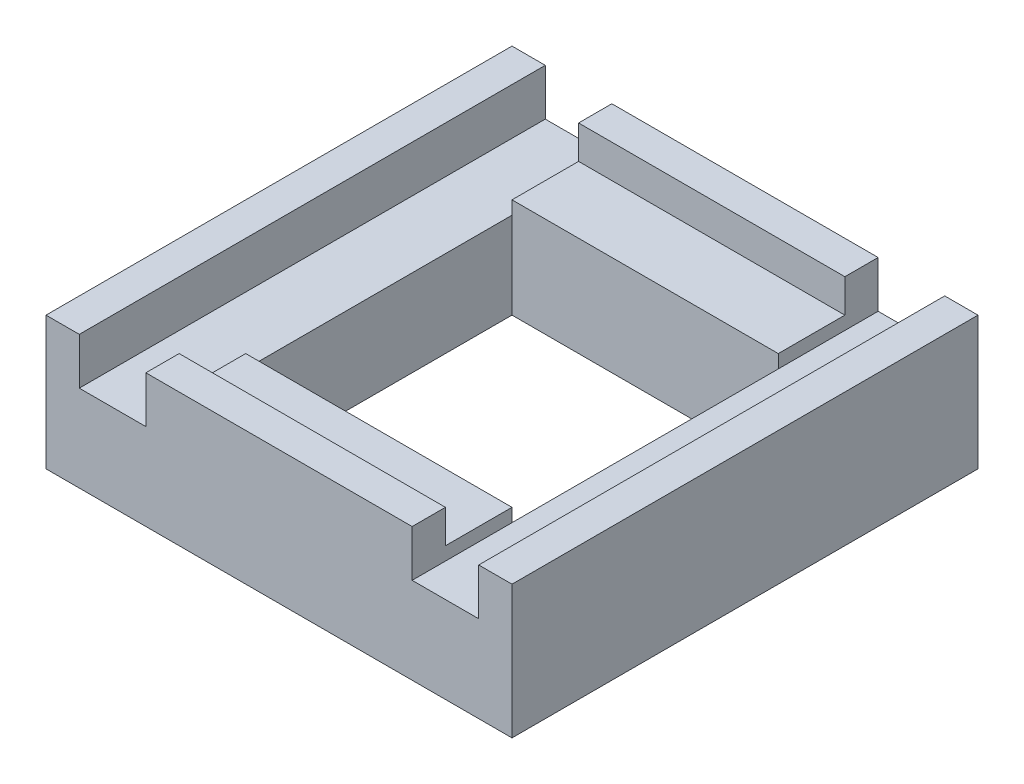
ISO-10303-21;
HEADER;
FILE_DESCRIPTION(('STEP AP214'),'2;1');
FILE_NAME('part.step','',(''),(''),'','','');
FILE_SCHEMA(('AUTOMOTIVE_DESIGN { 1 0 10303 214 1 1 1 1 }'));
ENDSEC;
DATA;
#1=APPLICATION_CONTEXT('core data for automotive mechanical design processes');
#2=APPLICATION_PROTOCOL_DEFINITION('international standard','automotive_design',2000,#1);
#3=PRODUCT_CONTEXT('',#1,'mechanical');
#4=PRODUCT('Part','Part','',(#3));
#5=PRODUCT_RELATED_PRODUCT_CATEGORY('part','',(#4));
#6=PRODUCT_DEFINITION_FORMATION('','',#4);
#7=PRODUCT_DEFINITION_CONTEXT('part definition',#1,'design');
#8=PRODUCT_DEFINITION('design','',#6,#7);
#9=PRODUCT_DEFINITION_SHAPE('','',#8);
#10=(LENGTH_UNIT() NAMED_UNIT(*) SI_UNIT(.MILLI.,.METRE.));
#11=(NAMED_UNIT(*) PLANE_ANGLE_UNIT() SI_UNIT($,.RADIAN.));
#12=(NAMED_UNIT(*) SI_UNIT($,.STERADIAN.) SOLID_ANGLE_UNIT());
#13=UNCERTAINTY_MEASURE_WITH_UNIT(LENGTH_MEASURE(1.E-05),#10,'distance_accuracy_value','');
#14=(GEOMETRIC_REPRESENTATION_CONTEXT(3) GLOBAL_UNCERTAINTY_ASSIGNED_CONTEXT((#13)) GLOBAL_UNIT_ASSIGNED_CONTEXT((#10,
#11,#12)) REPRESENTATION_CONTEXT('',''));
#15=CARTESIAN_POINT('',(0.,0.,0.));
#16=DIRECTION('',(0.,0.,1.));
#17=DIRECTION('',(1.,0.,0.));
#18=AXIS2_PLACEMENT_3D('',#15,#16,#17);
#19=CARTESIAN_POINT('',(0.,15.,0.));
#20=DIRECTION('',(0.,1.,0.));
#21=DIRECTION('',(0.,0.,1.));
#22=AXIS2_PLACEMENT_3D('',#19,#20,#21);
#23=PLANE('',#22);
#24=DIRECTION('',(-1.,0.,0.));
#25=VECTOR('',#24,1.);
#26=CARTESIAN_POINT('',(15.,15.,-55.));
#27=LINE('',#26,#25);
#28=CARTESIAN_POINT('',(55.,15.,-55.));
#29=VERTEX_POINT('',#28);
#30=CARTESIAN_POINT('',(15.,15.,-55.));
#31=VERTEX_POINT('',#30);
#32=EDGE_CURVE('E191',#29,#31,#27,.T.);
#33=ORIENTED_EDGE('',*,*,#32,.F.);
#34=DIRECTION('',(0.,0.,-1.));
#35=VECTOR('',#34,1.);
#36=CARTESIAN_POINT('',(55.,15.,0.));
#37=LINE('',#36,#35);
#38=CARTESIAN_POINT('',(55.,15.,-65.));
#39=VERTEX_POINT('',#38);
#40=EDGE_CURVE('E204',#29,#39,#37,.T.);
#41=ORIENTED_EDGE('',*,*,#40,.T.);
#42=DIRECTION('',(-1.,0.,0.));
#43=VECTOR('',#42,1.);
#44=CARTESIAN_POINT('',(65.,15.,-65.));
#45=LINE('',#44,#43);
#46=CARTESIAN_POINT('',(15.,15.,-65.));
#47=VERTEX_POINT('',#46);
#48=EDGE_CURVE('E245',#39,#47,#45,.T.);
#49=ORIENTED_EDGE('',*,*,#48,.T.);
#50=DIRECTION('',(0.,0.,1.));
#51=VECTOR('',#50,1.);
#52=CARTESIAN_POINT('',(15.,15.,0.));
#53=LINE('',#52,#51);
#54=EDGE_CURVE('E11',#47,#31,#53,.T.);
#55=ORIENTED_EDGE('',*,*,#54,.T.);
#56=EDGE_LOOP('',(#33,#41,#49,#55));
#57=FACE_BOUND('',#56,.T.);
#58=ADVANCED_FACE('F33',(#57),#23,.T.);
#59=CARTESIAN_POINT('',(55.,20.,0.));
#60=DIRECTION('',(1.,0.,0.));
#61=DIRECTION('',(0.,0.,-1.));
#62=AXIS2_PLACEMENT_3D('',#59,#60,#61);
#63=PLANE('',#62);
#64=DIRECTION('',(0.,1.,0.));
#65=VECTOR('',#64,1.);
#66=CARTESIAN_POINT('',(55.,-37.,-55.));
#67=LINE('',#66,#65);
#68=CARTESIAN_POINT('',(55.,13.,-55.));
#69=VERTEX_POINT('',#68);
#70=EDGE_CURVE('E330',#69,#29,#67,.T.);
#71=ORIENTED_EDGE('',*,*,#70,.F.);
#72=DIRECTION('',(0.,0.,1.));
#73=VECTOR('',#72,1.);
#74=CARTESIAN_POINT('',(55.,13.,0.));
#75=LINE('',#74,#73);
#76=CARTESIAN_POINT('',(55.,13.,-70.));
#77=VERTEX_POINT('',#76);
#78=EDGE_CURVE('E284',#77,#69,#75,.T.);
#79=ORIENTED_EDGE('',*,*,#78,.F.);
#80=DIRECTION('',(0.,-1.,0.));
#81=VECTOR('',#80,1.);
#82=CARTESIAN_POINT('',(55.,20.,-70.));
#83=LINE('',#82,#81);
#84=CARTESIAN_POINT('',(55.,20.,-70.));
#85=VERTEX_POINT('',#84);
#86=EDGE_CURVE('E269',#85,#77,#83,.T.);
#87=ORIENTED_EDGE('',*,*,#86,.F.);
#88=DIRECTION('',(0.,0.,1.));
#89=VECTOR('',#88,1.);
#90=CARTESIAN_POINT('',(55.,20.,0.));
#91=LINE('',#90,#89);
#92=CARTESIAN_POINT('',(55.,20.,-65.));
#93=VERTEX_POINT('',#92);
#94=EDGE_CURVE('E278',#85,#93,#91,.T.);
#95=ORIENTED_EDGE('',*,*,#94,.T.);
#96=DIRECTION('',(0.,-1.,0.));
#97=VECTOR('',#96,1.);
#98=CARTESIAN_POINT('',(55.,15.,-65.));
#99=LINE('',#98,#97);
#100=EDGE_CURVE('E260',#93,#39,#99,.T.);
#101=ORIENTED_EDGE('',*,*,#100,.T.);
#102=ORIENTED_EDGE('',*,*,#40,.F.);
#103=EDGE_LOOP('',(#71,#79,#87,#95,#101,#102));
#104=FACE_BOUND('',#103,.T.);
#105=ADVANCED_FACE('F412',(#104),#63,.T.);
#106=CARTESIAN_POINT('',(15.,20.,0.));
#107=DIRECTION('',(-1.,0.,0.));
#108=DIRECTION('',(0.,0.,1.));
#109=AXIS2_PLACEMENT_3D('',#106,#107,#108);
#110=PLANE('',#109);
#111=DIRECTION('',(0.,1.,0.));
#112=VECTOR('',#111,1.);
#113=CARTESIAN_POINT('',(15.,-37.,-55.));
#114=LINE('',#113,#112);
#115=CARTESIAN_POINT('',(15.,13.,-55.));
#116=VERTEX_POINT('',#115);
#117=EDGE_CURVE('E333',#116,#31,#114,.T.);
#118=ORIENTED_EDGE('',*,*,#117,.T.);
#119=ORIENTED_EDGE('',*,*,#54,.F.);
#120=DIRECTION('',(0.,1.,0.));
#121=VECTOR('',#120,1.);
#122=CARTESIAN_POINT('',(15.,15.,-65.));
#123=LINE('',#122,#121);
#124=CARTESIAN_POINT('',(15.,20.,-65.));
#125=VERTEX_POINT('',#124);
#126=EDGE_CURVE('E254',#47,#125,#123,.T.);
#127=ORIENTED_EDGE('',*,*,#126,.T.);
#128=DIRECTION('',(0.,0.,-1.));
#129=VECTOR('',#128,1.);
#130=CARTESIAN_POINT('',(15.,20.,0.));
#131=LINE('',#130,#129);
#132=CARTESIAN_POINT('',(15.,20.,-70.));
#133=VERTEX_POINT('',#132);
#134=EDGE_CURVE('E308',#125,#133,#131,.T.);
#135=ORIENTED_EDGE('',*,*,#134,.T.);
#136=DIRECTION('',(0.,-1.,0.));
#137=VECTOR('',#136,1.);
#138=CARTESIAN_POINT('',(15.,20.,-70.));
#139=LINE('',#138,#137);
#140=CARTESIAN_POINT('',(15.,13.,-70.));
#141=VERTEX_POINT('',#140);
#142=EDGE_CURVE('E300',#133,#141,#139,.T.);
#143=ORIENTED_EDGE('',*,*,#142,.T.);
#144=DIRECTION('',(0.,0.,-1.));
#145=VECTOR('',#144,1.);
#146=CARTESIAN_POINT('',(15.,13.,0.));
#147=LINE('',#146,#145);
#148=EDGE_CURVE('E315',#116,#141,#147,.T.);
#149=ORIENTED_EDGE('',*,*,#148,.F.);
#150=EDGE_LOOP('',(#118,#119,#127,#135,#143,#149));
#151=FACE_BOUND('',#150,.T.);
#152=ADVANCED_FACE('F345',(#151),#110,.T.);
#153=CARTESIAN_POINT('',(0.,20.,0.));
#154=DIRECTION('',(0.,0.,-1.));
#155=DIRECTION('',(-1.,0.,0.));
#156=AXIS2_PLACEMENT_3D('',#153,#154,#155);
#157=PLANE('',#156);
#158=DIRECTION('',(0.,-1.,0.));
#159=VECTOR('',#158,1.);
#160=CARTESIAN_POINT('',(5.,20.,0.));
#161=LINE('',#160,#159);
#162=CARTESIAN_POINT('',(5.,20.,0.));
#163=VERTEX_POINT('',#162);
#164=CARTESIAN_POINT('',(5.,13.,0.));
#165=VERTEX_POINT('',#164);
#166=EDGE_CURVE('E265',#163,#165,#161,.T.);
#167=ORIENTED_EDGE('',*,*,#166,.F.);
#168=DIRECTION('',(1.,0.,0.));
#169=VECTOR('',#168,1.);
#170=CARTESIAN_POINT('',(0.,20.,0.));
#171=LINE('',#170,#169);
#172=CARTESIAN_POINT('',(0.,20.,0.));
#173=VERTEX_POINT('',#172);
#174=EDGE_CURVE('E236',#173,#163,#171,.T.);
#175=ORIENTED_EDGE('',*,*,#174,.F.);
#176=DIRECTION('',(0.,-1.,0.));
#177=VECTOR('',#176,1.);
#178=CARTESIAN_POINT('',(0.,20.,0.));
#179=LINE('',#178,#177);
#180=CARTESIAN_POINT('',(0.,0.,0.));
#181=VERTEX_POINT('',#180);
#182=EDGE_CURVE('E205',#173,#181,#179,.T.);
#183=ORIENTED_EDGE('',*,*,#182,.T.);
#184=DIRECTION('',(1.,0.,0.));
#185=VECTOR('',#184,1.);
#186=CARTESIAN_POINT('',(0.,0.,0.));
#187=LINE('',#186,#185);
#188=CARTESIAN_POINT('',(70.,0.,0.));
#189=VERTEX_POINT('',#188);
#190=EDGE_CURVE('E224',#181,#189,#187,.T.);
#191=ORIENTED_EDGE('',*,*,#190,.T.);
#192=DIRECTION('',(0.,-1.,0.));
#193=VECTOR('',#192,1.);
#194=CARTESIAN_POINT('',(70.,20.,0.));
#195=LINE('',#194,#193);
#196=CARTESIAN_POINT('',(70.,20.,0.));
#197=VERTEX_POINT('',#196);
#198=EDGE_CURVE('E209',#197,#189,#195,.T.);
#199=ORIENTED_EDGE('',*,*,#198,.F.);
#200=CARTESIAN_POINT('',(65.,20.,0.));
#201=VERTEX_POINT('',#200);
#202=EDGE_CURVE('E240',#201,#197,#171,.T.);
#203=ORIENTED_EDGE('',*,*,#202,.F.);
#204=DIRECTION('',(0.,-1.,0.));
#205=VECTOR('',#204,1.);
#206=CARTESIAN_POINT('',(65.,20.,0.));
#207=LINE('',#206,#205);
#208=CARTESIAN_POINT('',(65.,13.,0.));
#209=VERTEX_POINT('',#208);
#210=EDGE_CURVE('E275',#201,#209,#207,.T.);
#211=ORIENTED_EDGE('',*,*,#210,.T.);
#212=DIRECTION('',(1.,0.,0.));
#213=VECTOR('',#212,1.);
#214=CARTESIAN_POINT('',(65.,13.,0.));
#215=LINE('',#214,#213);
#216=CARTESIAN_POINT('',(55.,13.,0.));
#217=VERTEX_POINT('',#216);
#218=EDGE_CURVE('E281',#217,#209,#215,.T.);
#219=ORIENTED_EDGE('',*,*,#218,.F.);
#220=DIRECTION('',(0.,-1.,0.));
#221=VECTOR('',#220,1.);
#222=CARTESIAN_POINT('',(55.,20.,0.));
#223=LINE('',#222,#221);
#224=CARTESIAN_POINT('',(55.,20.,0.));
#225=VERTEX_POINT('',#224);
#226=EDGE_CURVE('E272',#225,#217,#223,.T.);
#227=ORIENTED_EDGE('',*,*,#226,.F.);
#228=CARTESIAN_POINT('',(15.,20.,0.));
#229=VERTEX_POINT('',#228);
#230=EDGE_CURVE('E239',#229,#225,#171,.T.);
#231=ORIENTED_EDGE('',*,*,#230,.F.);
#232=DIRECTION('',(0.,-1.,0.));
#233=VECTOR('',#232,1.);
#234=CARTESIAN_POINT('',(15.,20.,0.));
#235=LINE('',#234,#233);
#236=CARTESIAN_POINT('',(15.,13.,0.));
#237=VERTEX_POINT('',#236);
#238=EDGE_CURVE('E297',#229,#237,#235,.T.);
#239=ORIENTED_EDGE('',*,*,#238,.T.);
#240=DIRECTION('',(1.,0.,0.));
#241=VECTOR('',#240,1.);
#242=CARTESIAN_POINT('',(5.,13.,0.));
#243=LINE('',#242,#241);
#244=EDGE_CURVE('E316',#165,#237,#243,.T.);
#245=ORIENTED_EDGE('',*,*,#244,.F.);
#246=EDGE_LOOP('',(#167,#175,#183,#191,#199,#203,#211,#219,#227,#231,#239,#245));
#247=FACE_BOUND('',#246,.T.);
#248=ADVANCED_FACE('F374',(#247),#157,.F.);
#249=CARTESIAN_POINT('',(0.,20.,-70.));
#250=DIRECTION('',(0.,0.,1.));
#251=DIRECTION('',(1.,0.,0.));
#252=AXIS2_PLACEMENT_3D('',#249,#250,#251);
#253=PLANE('',#252);
#254=DIRECTION('',(0.,-1.,0.));
#255=VECTOR('',#254,1.);
#256=CARTESIAN_POINT('',(5.,20.,-70.));
#257=LINE('',#256,#255);
#258=CARTESIAN_POINT('',(5.,20.,-70.));
#259=VERTEX_POINT('',#258);
#260=CARTESIAN_POINT('',(5.,13.,-70.));
#261=VERTEX_POINT('',#260);
#262=EDGE_CURVE('E303',#259,#261,#257,.T.);
#263=ORIENTED_EDGE('',*,*,#262,.T.);
#264=DIRECTION('',(-1.,0.,0.));
#265=VECTOR('',#264,1.);
#266=CARTESIAN_POINT('',(5.,13.,-70.));
#267=LINE('',#266,#265);
#268=EDGE_CURVE('E309',#141,#261,#267,.T.);
#269=ORIENTED_EDGE('',*,*,#268,.F.);
#270=ORIENTED_EDGE('',*,*,#142,.F.);
#271=DIRECTION('',(-1.,0.,0.));
#272=VECTOR('',#271,1.);
#273=CARTESIAN_POINT('',(0.,20.,-70.));
#274=LINE('',#273,#272);
#275=EDGE_CURVE('E232',#85,#133,#274,.T.);
#276=ORIENTED_EDGE('',*,*,#275,.F.);
#277=ORIENTED_EDGE('',*,*,#86,.T.);
#278=DIRECTION('',(-1.,0.,0.));
#279=VECTOR('',#278,1.);
#280=CARTESIAN_POINT('',(65.,13.,-70.));
#281=LINE('',#280,#279);
#282=CARTESIAN_POINT('',(65.,13.,-70.));
#283=VERTEX_POINT('',#282);
#284=EDGE_CURVE('E289',#283,#77,#281,.T.);
#285=ORIENTED_EDGE('',*,*,#284,.F.);
#286=DIRECTION('',(0.,-1.,0.));
#287=VECTOR('',#286,1.);
#288=CARTESIAN_POINT('',(65.,20.,-70.));
#289=LINE('',#288,#287);
#290=CARTESIAN_POINT('',(65.,20.,-70.));
#291=VERTEX_POINT('',#290);
#292=EDGE_CURVE('E266',#291,#283,#289,.T.);
#293=ORIENTED_EDGE('',*,*,#292,.F.);
#294=CARTESIAN_POINT('',(70.,20.,-70.));
#295=VERTEX_POINT('',#294);
#296=EDGE_CURVE('E218',#295,#291,#274,.T.);
#297=ORIENTED_EDGE('',*,*,#296,.F.);
#298=DIRECTION('',(0.,-1.,0.));
#299=VECTOR('',#298,1.);
#300=CARTESIAN_POINT('',(70.,20.,-70.));
#301=LINE('',#300,#299);
#302=CARTESIAN_POINT('',(70.,0.,-70.));
#303=VERTEX_POINT('',#302);
#304=EDGE_CURVE('E212',#295,#303,#301,.T.);
#305=ORIENTED_EDGE('',*,*,#304,.T.);
#306=DIRECTION('',(-1.,0.,0.));
#307=VECTOR('',#306,1.);
#308=CARTESIAN_POINT('',(0.,0.,-70.));
#309=LINE('',#308,#307);
#310=CARTESIAN_POINT('',(0.,0.,-70.));
#311=VERTEX_POINT('',#310);
#312=EDGE_CURVE('E219',#303,#311,#309,.T.);
#313=ORIENTED_EDGE('',*,*,#312,.T.);
#314=DIRECTION('',(0.,-1.,0.));
#315=VECTOR('',#314,1.);
#316=CARTESIAN_POINT('',(0.,20.,-70.));
#317=LINE('',#316,#315);
#318=CARTESIAN_POINT('',(0.,20.,-70.));
#319=VERTEX_POINT('',#318);
#320=EDGE_CURVE('E215',#319,#311,#317,.T.);
#321=ORIENTED_EDGE('',*,*,#320,.F.);
#322=EDGE_CURVE('E233',#259,#319,#274,.T.);
#323=ORIENTED_EDGE('',*,*,#322,.F.);
#324=EDGE_LOOP('',(#263,#269,#270,#276,#277,#285,#293,#297,#305,#313,#321,#323));
#325=FACE_BOUND('',#324,.T.);
#326=ADVANCED_FACE('F368',(#325),#253,.F.);
#327=CARTESIAN_POINT('',(0.,20.,0.));
#328=DIRECTION('',(0.,-1.,0.));
#329=DIRECTION('',(0.,0.,-1.));
#330=AXIS2_PLACEMENT_3D('',#327,#328,#329);
#331=PLANE('',#330);
#332=DIRECTION('',(0.,0.,1.));
#333=VECTOR('',#332,1.);
#334=CARTESIAN_POINT('',(5.,20.,-65.));
#335=LINE('',#334,#333);
#336=EDGE_CURVE('E249',#259,#163,#335,.T.);
#337=ORIENTED_EDGE('',*,*,#336,.F.);
#338=ORIENTED_EDGE('',*,*,#322,.T.);
#339=DIRECTION('',(0.,0.,1.));
#340=VECTOR('',#339,1.);
#341=CARTESIAN_POINT('',(0.,20.,0.));
#342=LINE('',#341,#340);
#343=EDGE_CURVE('E221',#319,#173,#342,.T.);
#344=ORIENTED_EDGE('',*,*,#343,.T.);
#345=ORIENTED_EDGE('',*,*,#174,.T.);
#346=EDGE_LOOP('',(#337,#338,#344,#345));
#347=FACE_BOUND('',#346,.T.);
#348=ADVANCED_FACE('F364',(#347),#331,.F.);
#349=CARTESIAN_POINT('',(15.,20.,-5.));
#350=VERTEX_POINT('',#349);
#351=EDGE_CURVE('E306',#229,#350,#131,.T.);
#352=ORIENTED_EDGE('',*,*,#351,.F.);
#353=ORIENTED_EDGE('',*,*,#230,.T.);
#354=CARTESIAN_POINT('',(55.,20.,-5.));
#355=VERTEX_POINT('',#354);
#356=EDGE_CURVE('E280',#355,#225,#91,.T.);
#357=ORIENTED_EDGE('',*,*,#356,.F.);
#358=DIRECTION('',(1.,0.,0.));
#359=VECTOR('',#358,1.);
#360=CARTESIAN_POINT('',(5.,20.,-5.));
#361=LINE('',#360,#359);
#362=EDGE_CURVE('E246',#350,#355,#361,.T.);
#363=ORIENTED_EDGE('',*,*,#362,.F.);
#364=EDGE_LOOP('',(#352,#353,#357,#363));
#365=FACE_BOUND('',#364,.T.);
#366=ADVANCED_FACE('F440',(#365),#331,.F.);
#367=ORIENTED_EDGE('',*,*,#134,.F.);
#368=DIRECTION('',(-1.,0.,0.));
#369=VECTOR('',#368,1.);
#370=CARTESIAN_POINT('',(65.,20.,-65.));
#371=LINE('',#370,#369);
#372=EDGE_CURVE('E251',#93,#125,#371,.T.);
#373=ORIENTED_EDGE('',*,*,#372,.F.);
#374=ORIENTED_EDGE('',*,*,#94,.F.);
#375=ORIENTED_EDGE('',*,*,#275,.T.);
#376=EDGE_LOOP('',(#367,#373,#374,#375));
#377=FACE_BOUND('',#376,.T.);
#378=ADVANCED_FACE('F357',(#377),#331,.F.);
#379=DIRECTION('',(0.,0.,-1.));
#380=VECTOR('',#379,1.);
#381=CARTESIAN_POINT('',(65.,20.,-5.));
#382=LINE('',#381,#380);
#383=EDGE_CURVE('E243',#201,#291,#382,.T.);
#384=ORIENTED_EDGE('',*,*,#383,.F.);
#385=ORIENTED_EDGE('',*,*,#202,.T.);
#386=DIRECTION('',(0.,0.,-1.));
#387=VECTOR('',#386,1.);
#388=CARTESIAN_POINT('',(70.,20.,0.));
#389=LINE('',#388,#387);
#390=EDGE_CURVE('E234',#197,#295,#389,.T.);
#391=ORIENTED_EDGE('',*,*,#390,.T.);
#392=ORIENTED_EDGE('',*,*,#296,.T.);
#393=EDGE_LOOP('',(#384,#385,#391,#392));
#394=FACE_BOUND('',#393,.T.);
#395=ADVANCED_FACE('F437',(#394),#331,.F.);
#396=CARTESIAN_POINT('',(65.,15.,-65.));
#397=DIRECTION('',(0.,0.,-1.));
#398=DIRECTION('',(-1.,0.,0.));
#399=AXIS2_PLACEMENT_3D('',#396,#397,#398);
#400=PLANE('',#399);
#401=ORIENTED_EDGE('',*,*,#126,.F.);
#402=ORIENTED_EDGE('',*,*,#48,.F.);
#403=ORIENTED_EDGE('',*,*,#100,.F.);
#404=ORIENTED_EDGE('',*,*,#372,.T.);
#405=EDGE_LOOP('',(#401,#402,#403,#404));
#406=FACE_BOUND('',#405,.T.);
#407=ADVANCED_FACE('F351',(#406),#400,.F.);
#408=CARTESIAN_POINT('',(5.,15.,-5.));
#409=DIRECTION('',(0.,0.,1.));
#410=DIRECTION('',(1.,0.,0.));
#411=AXIS2_PLACEMENT_3D('',#408,#409,#410);
#412=PLANE('',#411);
#413=DIRECTION('',(0.,-1.,0.));
#414=VECTOR('',#413,1.);
#415=CARTESIAN_POINT('',(15.,15.,-5.));
#416=LINE('',#415,#414);
#417=CARTESIAN_POINT('',(15.,15.,-5.));
#418=VERTEX_POINT('',#417);
#419=EDGE_CURVE('E202',#350,#418,#416,.T.);
#420=ORIENTED_EDGE('',*,*,#419,.F.);
#421=ORIENTED_EDGE('',*,*,#362,.T.);
#422=DIRECTION('',(0.,1.,0.));
#423=VECTOR('',#422,1.);
#424=CARTESIAN_POINT('',(55.,15.,-5.));
#425=LINE('',#424,#423);
#426=CARTESIAN_POINT('',(55.,15.,-5.));
#427=VERTEX_POINT('',#426);
#428=EDGE_CURVE('E263',#427,#355,#425,.T.);
#429=ORIENTED_EDGE('',*,*,#428,.F.);
#430=DIRECTION('',(1.,0.,0.));
#431=VECTOR('',#430,1.);
#432=CARTESIAN_POINT('',(5.,15.,-5.));
#433=LINE('',#432,#431);
#434=EDGE_CURVE('E229',#418,#427,#433,.T.);
#435=ORIENTED_EDGE('',*,*,#434,.F.);
#436=EDGE_LOOP('',(#420,#421,#429,#435));
#437=FACE_BOUND('',#436,.T.);
#438=ADVANCED_FACE('F434',(#437),#412,.F.);
#439=DIRECTION('',(1.,0.,0.));
#440=VECTOR('',#439,1.);
#441=CARTESIAN_POINT('',(15.,15.,-15.));
#442=LINE('',#441,#440);
#443=CARTESIAN_POINT('',(15.,15.,-15.));
#444=VERTEX_POINT('',#443);
#445=CARTESIAN_POINT('',(55.,15.,-15.));
#446=VERTEX_POINT('',#445);
#447=EDGE_CURVE('E184',#444,#446,#442,.T.);
#448=ORIENTED_EDGE('',*,*,#447,.F.);
#449=EDGE_CURVE('E41',#444,#418,#53,.T.);
#450=ORIENTED_EDGE('',*,*,#449,.T.);
#451=ORIENTED_EDGE('',*,*,#434,.T.);
#452=EDGE_CURVE('E198',#427,#446,#37,.T.);
#453=ORIENTED_EDGE('',*,*,#452,.T.);
#454=EDGE_LOOP('',(#448,#450,#451,#453));
#455=FACE_BOUND('',#454,.T.);
#456=ADVANCED_FACE('F195',(#455),#23,.T.);
#457=CARTESIAN_POINT('',(0.,20.,0.));
#458=DIRECTION('',(1.,0.,0.));
#459=DIRECTION('',(0.,0.,-1.));
#460=AXIS2_PLACEMENT_3D('',#457,#458,#459);
#461=PLANE('',#460);
#462=DIRECTION('',(0.,0.,1.));
#463=VECTOR('',#462,1.);
#464=CARTESIAN_POINT('',(0.,0.,0.));
#465=LINE('',#464,#463);
#466=EDGE_CURVE('E226',#311,#181,#465,.T.);
#467=ORIENTED_EDGE('',*,*,#466,.T.);
#468=ORIENTED_EDGE('',*,*,#182,.F.);
#469=ORIENTED_EDGE('',*,*,#343,.F.);
#470=ORIENTED_EDGE('',*,*,#320,.T.);
#471=EDGE_LOOP('',(#467,#468,#469,#470));
#472=FACE_BOUND('',#471,.T.);
#473=ADVANCED_FACE('F35',(#472),#461,.F.);
#474=CARTESIAN_POINT('',(70.,20.,0.));
#475=DIRECTION('',(-1.,0.,0.));
#476=DIRECTION('',(0.,0.,1.));
#477=AXIS2_PLACEMENT_3D('',#474,#475,#476);
#478=PLANE('',#477);
#479=DIRECTION('',(0.,0.,-1.));
#480=VECTOR('',#479,1.);
#481=CARTESIAN_POINT('',(70.,0.,0.));
#482=LINE('',#481,#480);
#483=EDGE_CURVE('E222',#189,#303,#482,.T.);
#484=ORIENTED_EDGE('',*,*,#483,.T.);
#485=ORIENTED_EDGE('',*,*,#304,.F.);
#486=ORIENTED_EDGE('',*,*,#390,.F.);
#487=ORIENTED_EDGE('',*,*,#198,.T.);
#488=EDGE_LOOP('',(#484,#485,#486,#487));
#489=FACE_BOUND('',#488,.T.);
#490=ADVANCED_FACE('F443',(#489),#478,.F.);
#491=CARTESIAN_POINT('',(0.,0.,0.));
#492=DIRECTION('',(0.,-1.,0.));
#493=DIRECTION('',(0.,0.,-1.));
#494=AXIS2_PLACEMENT_3D('',#491,#492,#493);
#495=PLANE('',#494);
#496=DIRECTION('',(0.,0.,-1.));
#497=VECTOR('',#496,1.);
#498=CARTESIAN_POINT('',(15.,0.,0.));
#499=LINE('',#498,#497);
#500=CARTESIAN_POINT('',(15.,0.,-15.));
#501=VERTEX_POINT('',#500);
#502=CARTESIAN_POINT('',(15.,0.,-55.));
#503=VERTEX_POINT('',#502);
#504=EDGE_CURVE('E326',#501,#503,#499,.T.);
#505=ORIENTED_EDGE('',*,*,#504,.F.);
#506=DIRECTION('',(-1.,0.,0.));
#507=VECTOR('',#506,1.);
#508=CARTESIAN_POINT('',(0.,0.,-15.));
#509=LINE('',#508,#507);
#510=CARTESIAN_POINT('',(55.,0.,-15.));
#511=VERTEX_POINT('',#510);
#512=EDGE_CURVE('E324',#511,#501,#509,.T.);
#513=ORIENTED_EDGE('',*,*,#512,.F.);
#514=DIRECTION('',(0.,0.,1.));
#515=VECTOR('',#514,1.);
#516=CARTESIAN_POINT('',(55.,0.,0.));
#517=LINE('',#516,#515);
#518=CARTESIAN_POINT('',(55.,0.,-55.));
#519=VERTEX_POINT('',#518);
#520=EDGE_CURVE('E295',#519,#511,#517,.T.);
#521=ORIENTED_EDGE('',*,*,#520,.F.);
#522=DIRECTION('',(1.,0.,0.));
#523=VECTOR('',#522,1.);
#524=CARTESIAN_POINT('',(0.,0.,-55.));
#525=LINE('',#524,#523);
#526=EDGE_CURVE('E322',#503,#519,#525,.T.);
#527=ORIENTED_EDGE('',*,*,#526,.F.);
#528=EDGE_LOOP('',(#505,#513,#521,#527));
#529=FACE_BOUND('',#528,.T.);
#530=ORIENTED_EDGE('',*,*,#466,.F.);
#531=ORIENTED_EDGE('',*,*,#312,.F.);
#532=ORIENTED_EDGE('',*,*,#483,.F.);
#533=ORIENTED_EDGE('',*,*,#190,.F.);
#534=EDGE_LOOP('',(#530,#531,#532,#533));
#535=FACE_BOUND('',#534,.T.);
#536=ADVANCED_FACE('F387',(#529,#535),#495,.T.);
#537=CARTESIAN_POINT('',(65.,15.,-5.));
#538=DIRECTION('',(1.,0.,0.));
#539=DIRECTION('',(0.,0.,-1.));
#540=AXIS2_PLACEMENT_3D('',#537,#538,#539);
#541=PLANE('',#540);
#542=ORIENTED_EDGE('',*,*,#383,.T.);
#543=ORIENTED_EDGE('',*,*,#292,.T.);
#544=DIRECTION('',(0.,0.,-1.));
#545=VECTOR('',#544,1.);
#546=CARTESIAN_POINT('',(65.,13.,0.));
#547=LINE('',#546,#545);
#548=EDGE_CURVE('E292',#209,#283,#547,.T.);
#549=ORIENTED_EDGE('',*,*,#548,.F.);
#550=ORIENTED_EDGE('',*,*,#210,.F.);
#551=EDGE_LOOP('',(#542,#543,#549,#550));
#552=FACE_BOUND('',#551,.T.);
#553=ADVANCED_FACE('F407',(#552),#541,.F.);
#554=CARTESIAN_POINT('',(5.,15.,-65.));
#555=DIRECTION('',(-1.,0.,0.));
#556=DIRECTION('',(0.,0.,1.));
#557=AXIS2_PLACEMENT_3D('',#554,#555,#556);
#558=PLANE('',#557);
#559=ORIENTED_EDGE('',*,*,#262,.F.);
#560=ORIENTED_EDGE('',*,*,#336,.T.);
#561=ORIENTED_EDGE('',*,*,#166,.T.);
#562=DIRECTION('',(0.,0.,1.));
#563=VECTOR('',#562,1.);
#564=CARTESIAN_POINT('',(5.,13.,0.));
#565=LINE('',#564,#563);
#566=EDGE_CURVE('E268',#261,#165,#565,.T.);
#567=ORIENTED_EDGE('',*,*,#566,.F.);
#568=EDGE_LOOP('',(#559,#560,#561,#567));
#569=FACE_BOUND('',#568,.T.);
#570=ADVANCED_FACE('F378',(#569),#558,.F.);
#571=DIRECTION('',(0.,1.,0.));
#572=VECTOR('',#571,1.);
#573=CARTESIAN_POINT('',(55.,-37.,-15.));
#574=LINE('',#573,#572);
#575=CARTESIAN_POINT('',(55.,13.,-15.));
#576=VERTEX_POINT('',#575);
#577=EDGE_CURVE('E328',#576,#446,#574,.T.);
#578=ORIENTED_EDGE('',*,*,#577,.T.);
#579=ORIENTED_EDGE('',*,*,#452,.F.);
#580=ORIENTED_EDGE('',*,*,#428,.T.);
#581=ORIENTED_EDGE('',*,*,#356,.T.);
#582=ORIENTED_EDGE('',*,*,#226,.T.);
#583=EDGE_CURVE('E288',#576,#217,#75,.T.);
#584=ORIENTED_EDGE('',*,*,#583,.F.);
#585=EDGE_LOOP('',(#578,#579,#580,#581,#582,#584));
#586=FACE_BOUND('',#585,.T.);
#587=ADVANCED_FACE('F400',(#586),#63,.T.);
#588=CARTESIAN_POINT('',(0.,13.,0.));
#589=DIRECTION('',(0.,1.,0.));
#590=DIRECTION('',(0.,0.,1.));
#591=AXIS2_PLACEMENT_3D('',#588,#589,#590);
#592=PLANE('',#591);
#593=ORIENTED_EDGE('',*,*,#548,.T.);
#594=ORIENTED_EDGE('',*,*,#284,.T.);
#595=ORIENTED_EDGE('',*,*,#78,.T.);
#596=EDGE_CURVE('E287',#69,#576,#75,.T.);
#597=ORIENTED_EDGE('',*,*,#596,.T.);
#598=ORIENTED_EDGE('',*,*,#583,.T.);
#599=ORIENTED_EDGE('',*,*,#218,.T.);
#600=EDGE_LOOP('',(#593,#594,#595,#597,#598,#599));
#601=FACE_BOUND('',#600,.T.);
#602=ADVANCED_FACE('F396',(#601),#592,.T.);
#603=DIRECTION('',(0.,1.,0.));
#604=VECTOR('',#603,1.);
#605=CARTESIAN_POINT('',(15.,-37.,-15.));
#606=LINE('',#605,#604);
#607=CARTESIAN_POINT('',(15.,13.,-15.));
#608=VERTEX_POINT('',#607);
#609=EDGE_CURVE('E181',#608,#444,#606,.T.);
#610=ORIENTED_EDGE('',*,*,#609,.F.);
#611=EDGE_CURVE('E312',#237,#608,#147,.T.);
#612=ORIENTED_EDGE('',*,*,#611,.F.);
#613=ORIENTED_EDGE('',*,*,#238,.F.);
#614=ORIENTED_EDGE('',*,*,#351,.T.);
#615=ORIENTED_EDGE('',*,*,#419,.T.);
#616=ORIENTED_EDGE('',*,*,#449,.F.);
#617=EDGE_LOOP('',(#610,#612,#613,#614,#615,#616));
#618=FACE_BOUND('',#617,.T.);
#619=ADVANCED_FACE('F200',(#618),#110,.T.);
#620=CARTESIAN_POINT('',(0.,13.,0.));
#621=DIRECTION('',(0.,-1.,0.));
#622=DIRECTION('',(0.,0.,-1.));
#623=AXIS2_PLACEMENT_3D('',#620,#621,#622);
#624=PLANE('',#623);
#625=ORIENTED_EDGE('',*,*,#566,.T.);
#626=ORIENTED_EDGE('',*,*,#244,.T.);
#627=ORIENTED_EDGE('',*,*,#611,.T.);
#628=EDGE_CURVE('E314',#608,#116,#147,.T.);
#629=ORIENTED_EDGE('',*,*,#628,.T.);
#630=ORIENTED_EDGE('',*,*,#148,.T.);
#631=ORIENTED_EDGE('',*,*,#268,.T.);
#632=EDGE_LOOP('',(#625,#626,#627,#629,#630,#631));
#633=FACE_BOUND('',#632,.T.);
#634=ADVANCED_FACE('F380',(#633),#624,.F.);
#635=CARTESIAN_POINT('',(15.,-37.,-15.));
#636=DIRECTION('',(-1.,0.,0.));
#637=DIRECTION('',(0.,0.,1.));
#638=AXIS2_PLACEMENT_3D('',#635,#636,#637);
#639=PLANE('',#638);
#640=ORIENTED_EDGE('',*,*,#504,.T.);
#641=EDGE_CURVE('E56',#503,#116,#114,.T.);
#642=ORIENTED_EDGE('',*,*,#641,.T.);
#643=ORIENTED_EDGE('',*,*,#628,.F.);
#644=EDGE_CURVE('E187',#501,#608,#606,.T.);
#645=ORIENTED_EDGE('',*,*,#644,.F.);
#646=EDGE_LOOP('',(#640,#642,#643,#645));
#647=FACE_BOUND('',#646,.T.);
#648=ADVANCED_FACE('F382',(#647),#639,.F.);
#649=CARTESIAN_POINT('',(15.,-37.,-55.));
#650=DIRECTION('',(0.,0.,-1.));
#651=DIRECTION('',(-1.,0.,0.));
#652=AXIS2_PLACEMENT_3D('',#649,#650,#651);
#653=PLANE('',#652);
#654=ORIENTED_EDGE('',*,*,#526,.T.);
#655=EDGE_CURVE('E332',#519,#69,#67,.T.);
#656=ORIENTED_EDGE('',*,*,#655,.T.);
#657=ORIENTED_EDGE('',*,*,#70,.T.);
#658=ORIENTED_EDGE('',*,*,#32,.T.);
#659=ORIENTED_EDGE('',*,*,#117,.F.);
#660=ORIENTED_EDGE('',*,*,#641,.F.);
#661=EDGE_LOOP('',(#654,#656,#657,#658,#659,#660));
#662=FACE_BOUND('',#661,.T.);
#663=ADVANCED_FACE('F338',(#662),#653,.F.);
#664=CARTESIAN_POINT('',(55.,-37.,-15.));
#665=DIRECTION('',(1.,0.,0.));
#666=DIRECTION('',(0.,0.,-1.));
#667=AXIS2_PLACEMENT_3D('',#664,#665,#666);
#668=PLANE('',#667);
#669=ORIENTED_EDGE('',*,*,#520,.T.);
#670=EDGE_CURVE('E48',#511,#576,#574,.T.);
#671=ORIENTED_EDGE('',*,*,#670,.T.);
#672=ORIENTED_EDGE('',*,*,#596,.F.);
#673=ORIENTED_EDGE('',*,*,#655,.F.);
#674=EDGE_LOOP('',(#669,#671,#672,#673));
#675=FACE_BOUND('',#674,.T.);
#676=ADVANCED_FACE('F392',(#675),#668,.F.);
#677=CARTESIAN_POINT('',(15.,-37.,-15.));
#678=DIRECTION('',(0.,0.,1.));
#679=DIRECTION('',(1.,0.,0.));
#680=AXIS2_PLACEMENT_3D('',#677,#678,#679);
#681=PLANE('',#680);
#682=ORIENTED_EDGE('',*,*,#512,.T.);
#683=ORIENTED_EDGE('',*,*,#644,.T.);
#684=ORIENTED_EDGE('',*,*,#609,.T.);
#685=ORIENTED_EDGE('',*,*,#447,.T.);
#686=ORIENTED_EDGE('',*,*,#577,.F.);
#687=ORIENTED_EDGE('',*,*,#670,.F.);
#688=EDGE_LOOP('',(#682,#683,#684,#685,#686,#687));
#689=FACE_BOUND('',#688,.T.);
#690=ADVANCED_FACE('F183',(#689),#681,.F.);
#691=CLOSED_SHELL('',(#58,#105,#152,#248,#326,#348,#366,#378,#395,#407,#438,#456,#473,#490,#536,
#553,#570,#587,#602,#619,#634,#648,#663,#676,#690));
#692=MANIFOLD_SOLID_BREP('B2',#691);
#693=ADVANCED_BREP_SHAPE_REPRESENTATION('',(#18,#692),#14);
#694=SHAPE_DEFINITION_REPRESENTATION(#9,#693);
ENDSEC;
END-ISO-10303-21;
